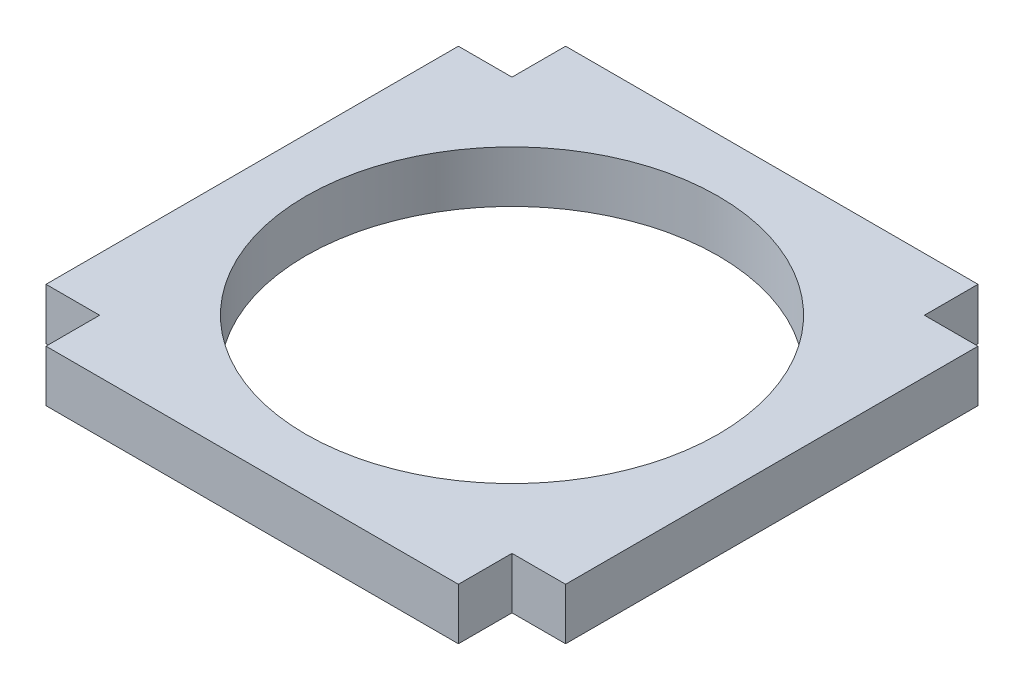
ISO-10303-21;
HEADER;
FILE_DESCRIPTION(('STEP AP214'),'2;1');
FILE_NAME('part.step','',(''),(''),'','','');
FILE_SCHEMA(('AUTOMOTIVE_DESIGN { 1 0 10303 214 1 1 1 1 }'));
ENDSEC;
DATA;
#1=APPLICATION_CONTEXT('core data for automotive mechanical design processes');
#2=APPLICATION_PROTOCOL_DEFINITION('international standard','automotive_design',2000,#1);
#3=PRODUCT_CONTEXT('',#1,'mechanical');
#4=PRODUCT('Part','Part','',(#3));
#5=PRODUCT_RELATED_PRODUCT_CATEGORY('part','',(#4));
#6=PRODUCT_DEFINITION_FORMATION('','',#4);
#7=PRODUCT_DEFINITION_CONTEXT('part definition',#1,'design');
#8=PRODUCT_DEFINITION('design','',#6,#7);
#9=PRODUCT_DEFINITION_SHAPE('','',#8);
#10=(LENGTH_UNIT() NAMED_UNIT(*) SI_UNIT(.MILLI.,.METRE.));
#11=(NAMED_UNIT(*) PLANE_ANGLE_UNIT() SI_UNIT($,.RADIAN.));
#12=(NAMED_UNIT(*) SI_UNIT($,.STERADIAN.) SOLID_ANGLE_UNIT());
#13=UNCERTAINTY_MEASURE_WITH_UNIT(LENGTH_MEASURE(1.E-05),#10,'distance_accuracy_value','');
#14=(GEOMETRIC_REPRESENTATION_CONTEXT(3) GLOBAL_UNCERTAINTY_ASSIGNED_CONTEXT((#13)) GLOBAL_UNIT_ASSIGNED_CONTEXT((#10,
#11,#12)) REPRESENTATION_CONTEXT('',''));
#15=CARTESIAN_POINT('',(0.,0.,0.));
#16=DIRECTION('',(0.,0.,1.));
#17=DIRECTION('',(1.,0.,0.));
#18=AXIS2_PLACEMENT_3D('',#15,#16,#17);
#19=CARTESIAN_POINT('',(0.,0.,0.));
#20=DIRECTION('',(0.,-1.,0.));
#21=DIRECTION('',(0.,0.,-1.));
#22=AXIS2_PLACEMENT_3D('',#19,#20,#21);
#23=PLANE('',#22);
#24=DIRECTION('',(-1.,0.,0.));
#25=VECTOR('',#24,1.);
#26=CARTESIAN_POINT('',(0.,0.,48.768808797007));
#27=LINE('',#26,#25);
#28=CARTESIAN_POINT('',(32.1364903341166,0.,48.768808797007));
#29=VERTEX_POINT('',#28);
#30=CARTESIAN_POINT('',(28.8344903341166,0.,48.768808797007));
#31=VERTEX_POINT('',#30);
#32=EDGE_CURVE('E257',#29,#31,#27,.T.);
#33=ORIENTED_EDGE('',*,*,#32,.T.);
#34=DIRECTION('',(0.,0.,1.));
#35=VECTOR('',#34,1.);
#36=CARTESIAN_POINT('',(28.8344903341166,0.,0.));
#37=LINE('',#36,#35);
#38=CARTESIAN_POINT('',(28.8344903341166,0.,23.368808797007));
#39=VERTEX_POINT('',#38);
#40=EDGE_CURVE('E113',#39,#31,#37,.T.);
#41=ORIENTED_EDGE('',*,*,#40,.F.);
#42=DIRECTION('',(-1.,0.,0.));
#43=VECTOR('',#42,1.);
#44=CARTESIAN_POINT('',(0.,0.,23.368808797007));
#45=LINE('',#44,#43);
#46=CARTESIAN_POINT('',(32.1364903341166,0.,23.368808797007));
#47=VERTEX_POINT('',#46);
#48=EDGE_CURVE('E218',#47,#39,#45,.T.);
#49=ORIENTED_EDGE('',*,*,#48,.F.);
#50=DIRECTION('',(0.,0.,-1.));
#51=VECTOR('',#50,1.);
#52=CARTESIAN_POINT('',(32.1364903341166,0.,0.));
#53=LINE('',#52,#51);
#54=CARTESIAN_POINT('',(32.1364903341166,0.,20.066808797007));
#55=VERTEX_POINT('',#54);
#56=EDGE_CURVE('E260',#47,#55,#53,.T.);
#57=ORIENTED_EDGE('',*,*,#56,.T.);
#58=DIRECTION('',(1.,0.,0.));
#59=VECTOR('',#58,1.);
#60=CARTESIAN_POINT('',(0.,0.,20.066808797007));
#61=LINE('',#60,#59);
#62=CARTESIAN_POINT('',(57.5364903341166,0.,20.066808797007));
#63=VERTEX_POINT('',#62);
#64=EDGE_CURVE('E202',#55,#63,#61,.T.);
#65=ORIENTED_EDGE('',*,*,#64,.T.);
#66=DIRECTION('',(0.,0.,-1.));
#67=VECTOR('',#66,1.);
#68=CARTESIAN_POINT('',(57.5364903341166,0.,0.));
#69=LINE('',#68,#67);
#70=CARTESIAN_POINT('',(57.5364903341166,0.,23.368808797007));
#71=VERTEX_POINT('',#70);
#72=EDGE_CURVE('E224',#71,#63,#69,.T.);
#73=ORIENTED_EDGE('',*,*,#72,.F.);
#74=DIRECTION('',(1.,0.,0.));
#75=VECTOR('',#74,1.);
#76=CARTESIAN_POINT('',(0.,0.,23.368808797007));
#77=LINE('',#76,#75);
#78=CARTESIAN_POINT('',(60.8384903341166,0.,23.368808797007));
#79=VERTEX_POINT('',#78);
#80=EDGE_CURVE('E265',#71,#79,#77,.T.);
#81=ORIENTED_EDGE('',*,*,#80,.T.);
#82=DIRECTION('',(0.,0.,-1.));
#83=VECTOR('',#82,1.);
#84=CARTESIAN_POINT('',(60.8384903341166,0.,0.));
#85=LINE('',#84,#83);
#86=CARTESIAN_POINT('',(60.8384903341166,0.,48.768808797007));
#87=VERTEX_POINT('',#86);
#88=EDGE_CURVE('E232',#87,#79,#85,.T.);
#89=ORIENTED_EDGE('',*,*,#88,.F.);
#90=DIRECTION('',(1.,0.,0.));
#91=VECTOR('',#90,1.);
#92=CARTESIAN_POINT('',(0.,0.,48.768808797007));
#93=LINE('',#92,#91);
#94=CARTESIAN_POINT('',(57.5364903341166,0.,48.768808797007));
#95=VERTEX_POINT('',#94);
#96=EDGE_CURVE('E237',#95,#87,#93,.T.);
#97=ORIENTED_EDGE('',*,*,#96,.F.);
#98=DIRECTION('',(0.,0.,-1.));
#99=VECTOR('',#98,1.);
#100=CARTESIAN_POINT('',(57.5364903341166,0.,0.));
#101=LINE('',#100,#99);
#102=CARTESIAN_POINT('',(57.5364903341166,0.,52.070808797007));
#103=VERTEX_POINT('',#102);
#104=EDGE_CURVE('E242',#103,#95,#101,.T.);
#105=ORIENTED_EDGE('',*,*,#104,.F.);
#106=DIRECTION('',(-1.,0.,0.));
#107=VECTOR('',#106,1.);
#108=CARTESIAN_POINT('',(0.,0.,52.070808797007));
#109=LINE('',#108,#107);
#110=CARTESIAN_POINT('',(32.1364903341166,0.,52.070808797007));
#111=VERTEX_POINT('',#110);
#112=EDGE_CURVE('E262',#103,#111,#109,.T.);
#113=ORIENTED_EDGE('',*,*,#112,.T.);
#114=DIRECTION('',(0.,0.,1.));
#115=VECTOR('',#114,1.);
#116=CARTESIAN_POINT('',(32.1364903341163,0.,-2.02596938406154E-13));
#117=LINE('',#116,#115);
#118=EDGE_CURVE('E250',#29,#111,#117,.T.);
#119=ORIENTED_EDGE('',*,*,#118,.F.);
#120=EDGE_LOOP('',(#33,#41,#49,#57,#65,#73,#81,#89,#97,#105,#113,#119));
#121=FACE_BOUND('',#120,.T.);
#122=CARTESIAN_POINT('',(44.8364903341166,0.,36.068808797007));
#123=DIRECTION('',(0.,1.,0.));
#124=DIRECTION('',(0.,0.,1.));
#125=AXIS2_PLACEMENT_3D('',#122,#123,#124);
#126=CIRCLE('',#125,12.7);
#127=CARTESIAN_POINT('',(44.8364903341166,0.,48.768808797007));
#128=VERTEX_POINT('',#127);
#129=EDGE_CURVE('E98',#128,#128,#126,.T.);
#130=ORIENTED_EDGE('',*,*,#129,.T.);
#131=EDGE_LOOP('',(#130));
#132=FACE_BOUND('',#131,.T.);
#133=ADVANCED_FACE('F94',(#121,#132),#23,.T.);
#134=CARTESIAN_POINT('',(0.,0.,23.368808797007));
#135=DIRECTION('',(0.,0.,-1.));
#136=DIRECTION('',(-1.,0.,0.));
#137=AXIS2_PLACEMENT_3D('',#134,#135,#136);
#138=PLANE('',#137);
#139=DIRECTION('',(1.,0.,0.));
#140=VECTOR('',#139,1.);
#141=CARTESIAN_POINT('',(0.,3.175,23.368808797007));
#142=LINE('',#141,#140);
#143=CARTESIAN_POINT('',(28.8344903341166,3.175,23.368808797007));
#144=VERTEX_POINT('',#143);
#145=CARTESIAN_POINT('',(32.1364903341166,3.175,23.368808797007));
#146=VERTEX_POINT('',#145);
#147=EDGE_CURVE('E216',#144,#146,#142,.T.);
#148=ORIENTED_EDGE('',*,*,#147,.T.);
#149=DIRECTION('',(0.,1.,0.));
#150=VECTOR('',#149,1.);
#151=CARTESIAN_POINT('',(32.1364903341166,0.,23.368808797007));
#152=LINE('',#151,#150);
#153=EDGE_CURVE('E191',#47,#146,#152,.T.);
#154=ORIENTED_EDGE('',*,*,#153,.F.);
#155=ORIENTED_EDGE('',*,*,#48,.T.);
#156=DIRECTION('',(0.,1.,0.));
#157=VECTOR('',#156,1.);
#158=CARTESIAN_POINT('',(28.8344903341166,0.,23.368808797007));
#159=LINE('',#158,#157);
#160=EDGE_CURVE('E168',#39,#144,#159,.T.);
#161=ORIENTED_EDGE('',*,*,#160,.T.);
#162=EDGE_LOOP('',(#148,#154,#155,#161));
#163=FACE_BOUND('',#162,.T.);
#164=ADVANCED_FACE('F313',(#163),#138,.T.);
#165=CARTESIAN_POINT('',(32.1364903341166,0.,0.));
#166=DIRECTION('',(1.,0.,0.));
#167=DIRECTION('',(0.,0.,-1.));
#168=AXIS2_PLACEMENT_3D('',#165,#166,#167);
#169=PLANE('',#168);
#170=DIRECTION('',(0.,1.,0.));
#171=VECTOR('',#170,1.);
#172=CARTESIAN_POINT('',(32.1364903341166,0.,20.066808797007));
#173=LINE('',#172,#171);
#174=CARTESIAN_POINT('',(32.1364903341166,3.175,20.066808797007));
#175=VERTEX_POINT('',#174);
#176=EDGE_CURVE('E159',#55,#175,#173,.T.);
#177=ORIENTED_EDGE('',*,*,#176,.F.);
#178=ORIENTED_EDGE('',*,*,#56,.F.);
#179=ORIENTED_EDGE('',*,*,#153,.T.);
#180=DIRECTION('',(0.,0.,1.));
#181=VECTOR('',#180,1.);
#182=CARTESIAN_POINT('',(32.1364903341166,3.175,0.));
#183=LINE('',#182,#181);
#184=EDGE_CURVE('E104',#175,#146,#183,.T.);
#185=ORIENTED_EDGE('',*,*,#184,.F.);
#186=EDGE_LOOP('',(#177,#178,#179,#185));
#187=FACE_BOUND('',#186,.T.);
#188=ADVANCED_FACE('F189',(#187),#169,.F.);
#189=CARTESIAN_POINT('',(0.,0.,20.066808797007));
#190=DIRECTION('',(0.,0.,1.));
#191=DIRECTION('',(1.,0.,0.));
#192=AXIS2_PLACEMENT_3D('',#189,#190,#191);
#193=PLANE('',#192);
#194=DIRECTION('',(0.,1.,0.));
#195=VECTOR('',#194,1.);
#196=CARTESIAN_POINT('',(57.5364903341166,0.,20.066808797007));
#197=LINE('',#196,#195);
#198=CARTESIAN_POINT('',(57.5364903341166,3.175,20.066808797007));
#199=VERTEX_POINT('',#198);
#200=EDGE_CURVE('E221',#63,#199,#197,.T.);
#201=ORIENTED_EDGE('',*,*,#200,.F.);
#202=ORIENTED_EDGE('',*,*,#64,.F.);
#203=ORIENTED_EDGE('',*,*,#176,.T.);
#204=DIRECTION('',(-1.,0.,0.));
#205=VECTOR('',#204,1.);
#206=CARTESIAN_POINT('',(0.,3.175,20.066808797007));
#207=LINE('',#206,#205);
#208=EDGE_CURVE('E195',#199,#175,#207,.T.);
#209=ORIENTED_EDGE('',*,*,#208,.F.);
#210=EDGE_LOOP('',(#201,#202,#203,#209));
#211=FACE_BOUND('',#210,.T.);
#212=ADVANCED_FACE('F199',(#211),#193,.F.);
#213=CARTESIAN_POINT('',(57.5364903341166,0.,0.));
#214=DIRECTION('',(1.,0.,0.));
#215=DIRECTION('',(0.,0.,-1.));
#216=AXIS2_PLACEMENT_3D('',#213,#214,#215);
#217=PLANE('',#216);
#218=DIRECTION('',(0.,0.,1.));
#219=VECTOR('',#218,1.);
#220=CARTESIAN_POINT('',(57.5364903341166,3.175,0.));
#221=LINE('',#220,#219);
#222=CARTESIAN_POINT('',(57.5364903341166,3.175,23.368808797007));
#223=VERTEX_POINT('',#222);
#224=EDGE_CURVE('E204',#199,#223,#221,.T.);
#225=ORIENTED_EDGE('',*,*,#224,.T.);
#226=DIRECTION('',(0.,1.,0.));
#227=VECTOR('',#226,1.);
#228=CARTESIAN_POINT('',(57.5364903341166,0.,23.368808797007));
#229=LINE('',#228,#227);
#230=EDGE_CURVE('E223',#71,#223,#229,.T.);
#231=ORIENTED_EDGE('',*,*,#230,.F.);
#232=ORIENTED_EDGE('',*,*,#72,.T.);
#233=ORIENTED_EDGE('',*,*,#200,.T.);
#234=EDGE_LOOP('',(#225,#231,#232,#233));
#235=FACE_BOUND('',#234,.T.);
#236=ADVANCED_FACE('F311',(#235),#217,.T.);
#237=CARTESIAN_POINT('',(0.,0.,23.368808797007));
#238=DIRECTION('',(0.,0.,1.));
#239=DIRECTION('',(1.,0.,0.));
#240=AXIS2_PLACEMENT_3D('',#237,#238,#239);
#241=PLANE('',#240);
#242=DIRECTION('',(0.,1.,0.));
#243=VECTOR('',#242,1.);
#244=CARTESIAN_POINT('',(60.8384903341166,0.,23.368808797007));
#245=LINE('',#244,#243);
#246=CARTESIAN_POINT('',(60.8384903341166,3.175,23.368808797007));
#247=VERTEX_POINT('',#246);
#248=EDGE_CURVE('E228',#79,#247,#245,.T.);
#249=ORIENTED_EDGE('',*,*,#248,.F.);
#250=ORIENTED_EDGE('',*,*,#80,.F.);
#251=ORIENTED_EDGE('',*,*,#230,.T.);
#252=DIRECTION('',(-1.,0.,0.));
#253=VECTOR('',#252,1.);
#254=CARTESIAN_POINT('',(0.,3.175,23.368808797007));
#255=LINE('',#254,#253);
#256=EDGE_CURVE('E210',#247,#223,#255,.T.);
#257=ORIENTED_EDGE('',*,*,#256,.F.);
#258=EDGE_LOOP('',(#249,#250,#251,#257));
#259=FACE_BOUND('',#258,.T.);
#260=ADVANCED_FACE('F309',(#259),#241,.F.);
#261=CARTESIAN_POINT('',(60.8384903341166,0.,0.));
#262=DIRECTION('',(1.,0.,0.));
#263=DIRECTION('',(0.,0.,-1.));
#264=AXIS2_PLACEMENT_3D('',#261,#262,#263);
#265=PLANE('',#264);
#266=DIRECTION('',(0.,0.,1.));
#267=VECTOR('',#266,1.);
#268=CARTESIAN_POINT('',(60.8384903341166,3.175,0.));
#269=LINE('',#268,#267);
#270=CARTESIAN_POINT('',(60.8384903341166,3.175,48.768808797007));
#271=VERTEX_POINT('',#270);
#272=EDGE_CURVE('E227',#247,#271,#269,.T.);
#273=ORIENTED_EDGE('',*,*,#272,.T.);
#274=DIRECTION('',(0.,1.,0.));
#275=VECTOR('',#274,1.);
#276=CARTESIAN_POINT('',(60.8384903341166,0.,48.768808797007));
#277=LINE('',#276,#275);
#278=EDGE_CURVE('E233',#87,#271,#277,.T.);
#279=ORIENTED_EDGE('',*,*,#278,.F.);
#280=ORIENTED_EDGE('',*,*,#88,.T.);
#281=ORIENTED_EDGE('',*,*,#248,.T.);
#282=EDGE_LOOP('',(#273,#279,#280,#281));
#283=FACE_BOUND('',#282,.T.);
#284=ADVANCED_FACE('F286',(#283),#265,.T.);
#285=CARTESIAN_POINT('',(0.,0.,48.768808797007));
#286=DIRECTION('',(0.,0.,1.));
#287=DIRECTION('',(1.,0.,0.));
#288=AXIS2_PLACEMENT_3D('',#285,#286,#287);
#289=PLANE('',#288);
#290=DIRECTION('',(-1.,0.,0.));
#291=VECTOR('',#290,1.);
#292=CARTESIAN_POINT('',(0.,3.175,48.768808797007));
#293=LINE('',#292,#291);
#294=CARTESIAN_POINT('',(57.5364903341166,3.175,48.768808797007));
#295=VERTEX_POINT('',#294);
#296=EDGE_CURVE('E231',#271,#295,#293,.T.);
#297=ORIENTED_EDGE('',*,*,#296,.T.);
#298=DIRECTION('',(0.,1.,0.));
#299=VECTOR('',#298,1.);
#300=CARTESIAN_POINT('',(57.5364903341166,0.,48.768808797007));
#301=LINE('',#300,#299);
#302=EDGE_CURVE('E238',#95,#295,#301,.T.);
#303=ORIENTED_EDGE('',*,*,#302,.F.);
#304=ORIENTED_EDGE('',*,*,#96,.T.);
#305=ORIENTED_EDGE('',*,*,#278,.T.);
#306=EDGE_LOOP('',(#297,#303,#304,#305));
#307=FACE_BOUND('',#306,.T.);
#308=ADVANCED_FACE('F291',(#307),#289,.T.);
#309=CARTESIAN_POINT('',(57.5364903341166,0.,0.));
#310=DIRECTION('',(1.,0.,0.));
#311=DIRECTION('',(0.,0.,-1.));
#312=AXIS2_PLACEMENT_3D('',#309,#310,#311);
#313=PLANE('',#312);
#314=DIRECTION('',(0.,0.,1.));
#315=VECTOR('',#314,1.);
#316=CARTESIAN_POINT('',(57.5364903341166,3.175,0.));
#317=LINE('',#316,#315);
#318=CARTESIAN_POINT('',(57.5364903341166,3.175,52.070808797007));
#319=VERTEX_POINT('',#318);
#320=EDGE_CURVE('E236',#295,#319,#317,.T.);
#321=ORIENTED_EDGE('',*,*,#320,.T.);
#322=DIRECTION('',(0.,1.,0.));
#323=VECTOR('',#322,1.);
#324=CARTESIAN_POINT('',(57.5364903341166,0.,52.070808797007));
#325=LINE('',#324,#323);
#326=EDGE_CURVE('E241',#103,#319,#325,.T.);
#327=ORIENTED_EDGE('',*,*,#326,.F.);
#328=ORIENTED_EDGE('',*,*,#104,.T.);
#329=ORIENTED_EDGE('',*,*,#302,.T.);
#330=EDGE_LOOP('',(#321,#327,#328,#329));
#331=FACE_BOUND('',#330,.T.);
#332=ADVANCED_FACE('F297',(#331),#313,.T.);
#333=CARTESIAN_POINT('',(0.,0.,52.070808797007));
#334=DIRECTION('',(0.,0.,-1.));
#335=DIRECTION('',(-1.,0.,0.));
#336=AXIS2_PLACEMENT_3D('',#333,#334,#335);
#337=PLANE('',#336);
#338=DIRECTION('',(0.,1.,0.));
#339=VECTOR('',#338,1.);
#340=CARTESIAN_POINT('',(32.1364903341166,0.,52.070808797007));
#341=LINE('',#340,#339);
#342=CARTESIAN_POINT('',(32.1364903341166,3.175,52.070808797007));
#343=VERTEX_POINT('',#342);
#344=EDGE_CURVE('E246',#111,#343,#341,.T.);
#345=ORIENTED_EDGE('',*,*,#344,.F.);
#346=ORIENTED_EDGE('',*,*,#112,.F.);
#347=ORIENTED_EDGE('',*,*,#326,.T.);
#348=DIRECTION('',(1.,0.,0.));
#349=VECTOR('',#348,1.);
#350=CARTESIAN_POINT('',(0.,3.175,52.070808797007));
#351=LINE('',#350,#349);
#352=EDGE_CURVE('E212',#343,#319,#351,.T.);
#353=ORIENTED_EDGE('',*,*,#352,.F.);
#354=EDGE_LOOP('',(#345,#346,#347,#353));
#355=FACE_BOUND('',#354,.T.);
#356=ADVANCED_FACE('F301',(#355),#337,.F.);
#357=CARTESIAN_POINT('',(32.1364903341163,0.,-2.02596938406154E-13));
#358=DIRECTION('',(-1.,0.,0.));
#359=DIRECTION('',(0.,0.,1.));
#360=AXIS2_PLACEMENT_3D('',#357,#358,#359);
#361=PLANE('',#360);
#362=DIRECTION('',(0.,0.,-1.));
#363=VECTOR('',#362,1.);
#364=CARTESIAN_POINT('',(32.1364903341163,3.175,-2.02596938406154E-13));
#365=LINE('',#364,#363);
#366=CARTESIAN_POINT('',(32.1364903341166,3.175,48.768808797007));
#367=VERTEX_POINT('',#366);
#368=EDGE_CURVE('E245',#343,#367,#365,.T.);
#369=ORIENTED_EDGE('',*,*,#368,.T.);
#370=DIRECTION('',(0.,1.,0.));
#371=VECTOR('',#370,1.);
#372=CARTESIAN_POINT('',(32.1364903341166,0.,48.768808797007));
#373=LINE('',#372,#371);
#374=EDGE_CURVE('E249',#29,#367,#373,.T.);
#375=ORIENTED_EDGE('',*,*,#374,.F.);
#376=ORIENTED_EDGE('',*,*,#118,.T.);
#377=ORIENTED_EDGE('',*,*,#344,.T.);
#378=EDGE_LOOP('',(#369,#375,#376,#377));
#379=FACE_BOUND('',#378,.T.);
#380=ADVANCED_FACE('F327',(#379),#361,.T.);
#381=CARTESIAN_POINT('',(0.,0.,48.768808797007));
#382=DIRECTION('',(0.,0.,-1.));
#383=DIRECTION('',(-1.,0.,0.));
#384=AXIS2_PLACEMENT_3D('',#381,#382,#383);
#385=PLANE('',#384);
#386=DIRECTION('',(0.,1.,0.));
#387=VECTOR('',#386,1.);
#388=CARTESIAN_POINT('',(28.8344903341166,0.,48.768808797007));
#389=LINE('',#388,#387);
#390=CARTESIAN_POINT('',(28.8344903341166,3.175,48.768808797007));
#391=VERTEX_POINT('',#390);
#392=EDGE_CURVE('E254',#31,#391,#389,.T.);
#393=ORIENTED_EDGE('',*,*,#392,.F.);
#394=ORIENTED_EDGE('',*,*,#32,.F.);
#395=ORIENTED_EDGE('',*,*,#374,.T.);
#396=DIRECTION('',(1.,0.,0.));
#397=VECTOR('',#396,1.);
#398=CARTESIAN_POINT('',(0.,3.175,48.768808797007));
#399=LINE('',#398,#397);
#400=EDGE_CURVE('E256',#391,#367,#399,.T.);
#401=ORIENTED_EDGE('',*,*,#400,.F.);
#402=EDGE_LOOP('',(#393,#394,#395,#401));
#403=FACE_BOUND('',#402,.T.);
#404=ADVANCED_FACE('F315',(#403),#385,.F.);
#405=CARTESIAN_POINT('',(28.8344903341166,0.,0.));
#406=DIRECTION('',(-1.,0.,0.));
#407=DIRECTION('',(0.,0.,1.));
#408=AXIS2_PLACEMENT_3D('',#405,#406,#407);
#409=PLANE('',#408);
#410=DIRECTION('',(0.,0.,-1.));
#411=VECTOR('',#410,1.);
#412=CARTESIAN_POINT('',(28.8344903341166,3.175,0.));
#413=LINE('',#412,#411);
#414=EDGE_CURVE('E253',#391,#144,#413,.T.);
#415=ORIENTED_EDGE('',*,*,#414,.T.);
#416=ORIENTED_EDGE('',*,*,#160,.F.);
#417=ORIENTED_EDGE('',*,*,#40,.T.);
#418=ORIENTED_EDGE('',*,*,#392,.T.);
#419=EDGE_LOOP('',(#415,#416,#417,#418));
#420=FACE_BOUND('',#419,.T.);
#421=ADVANCED_FACE('F317',(#420),#409,.T.);
#422=CARTESIAN_POINT('',(44.8364903341166,0.,36.068808797007));
#423=DIRECTION('',(0.,1.,0.));
#424=DIRECTION('',(0.,0.,1.));
#425=AXIS2_PLACEMENT_3D('',#422,#423,#424);
#426=CYLINDRICAL_SURFACE('',#425,12.7);
#427=ORIENTED_EDGE('',*,*,#129,.F.);
#428=EDGE_LOOP('',(#427));
#429=FACE_BOUND('',#428,.T.);
#430=CARTESIAN_POINT('',(44.8364903341166,3.175,36.068808797007));
#431=DIRECTION('',(0.,-1.,0.));
#432=DIRECTION('',(0.,0.,-1.));
#433=AXIS2_PLACEMENT_3D('',#430,#431,#432);
#434=CIRCLE('',#433,12.7);
#435=CARTESIAN_POINT('',(44.8364903341166,3.175,23.368808797007));
#436=VERTEX_POINT('',#435);
#437=EDGE_CURVE('E12',#436,#436,#434,.T.);
#438=ORIENTED_EDGE('',*,*,#437,.F.);
#439=EDGE_LOOP('',(#438));
#440=FACE_BOUND('',#439,.T.);
#441=ADVANCED_FACE('F319',(#429,#440),#426,.F.);
#442=CARTESIAN_POINT('',(0.,3.175,0.));
#443=DIRECTION('',(0.,-1.,0.));
#444=DIRECTION('',(0.,0.,-1.));
#445=AXIS2_PLACEMENT_3D('',#442,#443,#444);
#446=PLANE('',#445);
#447=ORIENTED_EDGE('',*,*,#414,.F.);
#448=ORIENTED_EDGE('',*,*,#400,.T.);
#449=ORIENTED_EDGE('',*,*,#368,.F.);
#450=ORIENTED_EDGE('',*,*,#352,.T.);
#451=ORIENTED_EDGE('',*,*,#320,.F.);
#452=ORIENTED_EDGE('',*,*,#296,.F.);
#453=ORIENTED_EDGE('',*,*,#272,.F.);
#454=ORIENTED_EDGE('',*,*,#256,.T.);
#455=ORIENTED_EDGE('',*,*,#224,.F.);
#456=ORIENTED_EDGE('',*,*,#208,.T.);
#457=ORIENTED_EDGE('',*,*,#184,.T.);
#458=ORIENTED_EDGE('',*,*,#147,.F.);
#459=EDGE_LOOP('',(#447,#448,#449,#450,#451,#452,#453,#454,#455,#456,#457,#458));
#460=FACE_BOUND('',#459,.T.);
#461=ORIENTED_EDGE('',*,*,#437,.T.);
#462=EDGE_LOOP('',(#461));
#463=FACE_BOUND('',#462,.T.);
#464=ADVANCED_FACE('F96',(#460,#463),#446,.F.);
#465=CLOSED_SHELL('',(#133,#164,#188,#212,#236,#260,#284,#308,#332,#356,#380,#404,#421,#441,#464));
#466=MANIFOLD_SOLID_BREP('B2',#465);
#467=ADVANCED_BREP_SHAPE_REPRESENTATION('',(#18,#466),#14);
#468=SHAPE_DEFINITION_REPRESENTATION(#9,#467);
ENDSEC;
END-ISO-10303-21;
